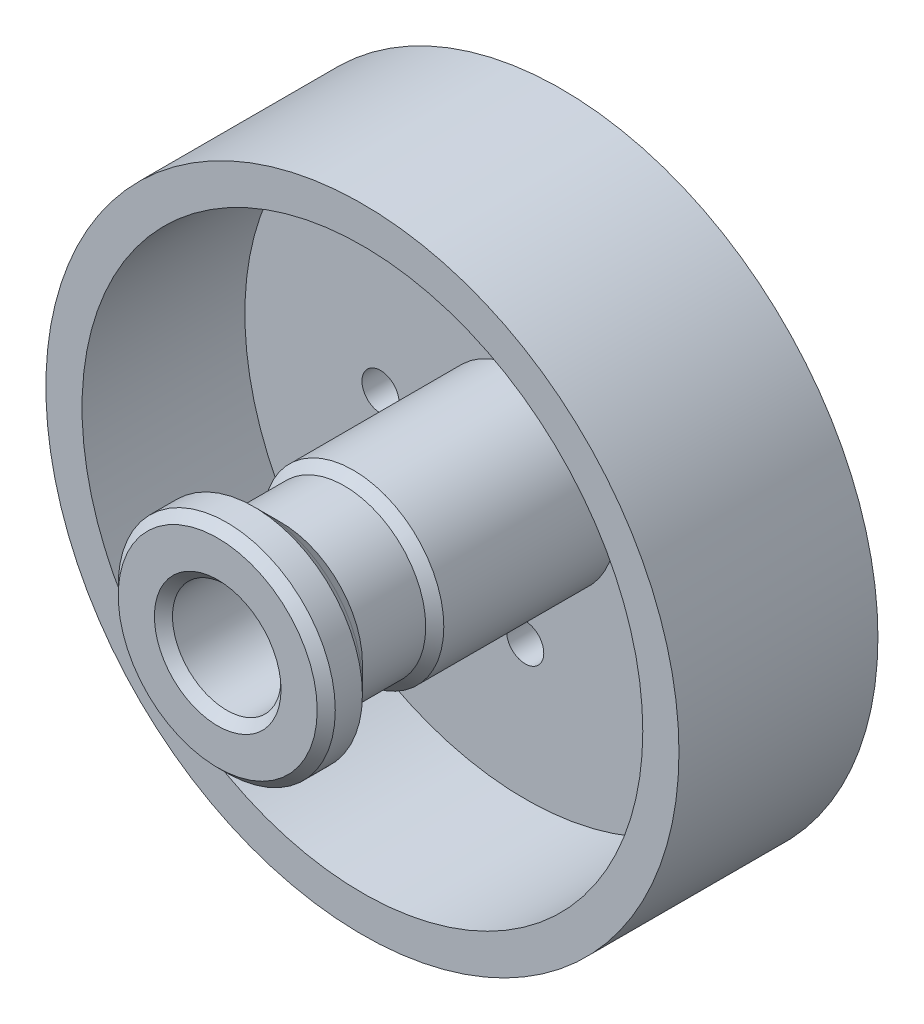
ISO-10303-21;
HEADER;
FILE_DESCRIPTION(('STEP AP214'),'2;1');
FILE_NAME('part.step','',(''),(''),'','','');
FILE_SCHEMA(('AUTOMOTIVE_DESIGN { 1 0 10303 214 1 1 1 1 }'));
ENDSEC;
DATA;
#1=APPLICATION_CONTEXT('core data for automotive mechanical design processes');
#2=APPLICATION_PROTOCOL_DEFINITION('international standard','automotive_design',2000,#1);
#3=PRODUCT_CONTEXT('',#1,'mechanical');
#4=PRODUCT('Part','Part','',(#3));
#5=PRODUCT_RELATED_PRODUCT_CATEGORY('part','',(#4));
#6=PRODUCT_DEFINITION_FORMATION('','',#4);
#7=PRODUCT_DEFINITION_CONTEXT('part definition',#1,'design');
#8=PRODUCT_DEFINITION('design','',#6,#7);
#9=PRODUCT_DEFINITION_SHAPE('','',#8);
#10=(LENGTH_UNIT() NAMED_UNIT(*) SI_UNIT(.MILLI.,.METRE.));
#11=(NAMED_UNIT(*) PLANE_ANGLE_UNIT() SI_UNIT($,.RADIAN.));
#12=(NAMED_UNIT(*) SI_UNIT($,.STERADIAN.) SOLID_ANGLE_UNIT());
#13=UNCERTAINTY_MEASURE_WITH_UNIT(LENGTH_MEASURE(1.E-05),#10,'distance_accuracy_value','');
#14=(GEOMETRIC_REPRESENTATION_CONTEXT(3) GLOBAL_UNCERTAINTY_ASSIGNED_CONTEXT((#13)) GLOBAL_UNIT_ASSIGNED_CONTEXT((#10,
#11,#12)) REPRESENTATION_CONTEXT('',''));
#15=CARTESIAN_POINT('',(0.,0.,0.));
#16=DIRECTION('',(0.,0.,1.));
#17=DIRECTION('',(1.,0.,0.));
#18=AXIS2_PLACEMENT_3D('',#15,#16,#17);
#19=CARTESIAN_POINT('',(0.,0.,8.));
#20=DIRECTION('',(0.,0.,-1.));
#21=DIRECTION('',(-1.,0.,0.));
#22=AXIS2_PLACEMENT_3D('',#19,#20,#21);
#23=CYLINDRICAL_SURFACE('',#22,4.5);
#24=CARTESIAN_POINT('',(0.,0.,4.50000000000001));
#25=DIRECTION('',(0.,0.,1.));
#26=DIRECTION('',(1.,0.,0.));
#27=AXIS2_PLACEMENT_3D('',#24,#25,#26);
#28=CIRCLE('',#27,4.5);
#29=CARTESIAN_POINT('',(4.5,0.,4.50000000000001));
#30=VERTEX_POINT('',#29);
#31=EDGE_CURVE('E50',#30,#30,#28,.F.);
#32=ORIENTED_EDGE('',*,*,#31,.T.);
#33=EDGE_LOOP('',(#32));
#34=FACE_BOUND('',#33,.T.);
#35=CARTESIAN_POINT('',(0.,0.,1.00000000000002));
#36=DIRECTION('',(0.,0.,1.));
#37=DIRECTION('',(1.,0.,0.));
#38=AXIS2_PLACEMENT_3D('',#35,#36,#37);
#39=CIRCLE('',#38,4.5);
#40=CARTESIAN_POINT('',(4.5,0.,1.00000000000002));
#41=VERTEX_POINT('',#40);
#42=EDGE_CURVE('E54',#41,#41,#39,.T.);
#43=ORIENTED_EDGE('',*,*,#42,.T.);
#44=EDGE_LOOP('',(#43));
#45=FACE_BOUND('',#44,.T.);
#46=ADVANCED_FACE('F42',(#34,#45),#23,.T.);
#47=CARTESIAN_POINT('',(0.,0.,-11.));
#48=DIRECTION('',(0.,0.,1.));
#49=DIRECTION('',(1.,0.,0.));
#50=AXIS2_PLACEMENT_3D('',#47,#48,#49);
#51=CYLINDRICAL_SURFACE('',#50,17.5);
#52=CARTESIAN_POINT('',(0.,0.,-11.));
#53=DIRECTION('',(0.,0.,1.));
#54=DIRECTION('',(1.,0.,0.));
#55=AXIS2_PLACEMENT_3D('',#52,#53,#54);
#56=CIRCLE('',#55,17.5);
#57=CARTESIAN_POINT('',(17.5,0.,-11.));
#58=VERTEX_POINT('',#57);
#59=EDGE_CURVE('E78',#58,#58,#56,.T.);
#60=ORIENTED_EDGE('',*,*,#59,.T.);
#61=EDGE_LOOP('',(#60));
#62=FACE_BOUND('',#61,.T.);
#63=CARTESIAN_POINT('',(0.,0.,0.));
#64=DIRECTION('',(0.,0.,1.));
#65=DIRECTION('',(1.,0.,0.));
#66=AXIS2_PLACEMENT_3D('',#63,#64,#65);
#67=CIRCLE('',#66,17.5);
#68=CARTESIAN_POINT('',(17.5,0.,0.));
#69=VERTEX_POINT('',#68);
#70=EDGE_CURVE('E92',#69,#69,#67,.T.);
#71=ORIENTED_EDGE('',*,*,#70,.F.);
#72=EDGE_LOOP('',(#71));
#73=FACE_BOUND('',#72,.T.);
#74=ADVANCED_FACE('F127',(#62,#73),#51,.T.);
#75=CARTESIAN_POINT('',(0.,0.,-11.));
#76=DIRECTION('',(0.,0.,1.));
#77=DIRECTION('',(1.,0.,0.));
#78=AXIS2_PLACEMENT_3D('',#75,#76,#77);
#79=PLANE('',#78);
#80=CARTESIAN_POINT('',(0.,7.99999999999999,-11.));
#81=DIRECTION('',(0.,0.,-1.));
#82=DIRECTION('',(-1.,0.,0.));
#83=AXIS2_PLACEMENT_3D('',#80,#81,#82);
#84=CIRCLE('',#83,1.02499999999999);
#85=CARTESIAN_POINT('',(-1.02499999999999,7.99999999999999,-11.));
#86=VERTEX_POINT('',#85);
#87=EDGE_CURVE('E83',#86,#86,#84,.T.);
#88=ORIENTED_EDGE('',*,*,#87,.F.);
#89=EDGE_LOOP('',(#88));
#90=FACE_BOUND('',#89,.T.);
#91=CARTESIAN_POINT('',(-7.99999999999999,0.,-11.));
#92=DIRECTION('',(0.,0.,-1.));
#93=DIRECTION('',(-1.,0.,0.));
#94=AXIS2_PLACEMENT_3D('',#91,#92,#93);
#95=CIRCLE('',#94,1.02499999999999);
#96=CARTESIAN_POINT('',(-9.02499999999998,0.,-11.));
#97=VERTEX_POINT('',#96);
#98=EDGE_CURVE('E82',#97,#97,#95,.T.);
#99=ORIENTED_EDGE('',*,*,#98,.F.);
#100=EDGE_LOOP('',(#99));
#101=FACE_BOUND('',#100,.T.);
#102=CARTESIAN_POINT('',(0.,-7.99999999999999,-11.));
#103=DIRECTION('',(0.,0.,-1.));
#104=DIRECTION('',(-1.,0.,0.));
#105=AXIS2_PLACEMENT_3D('',#102,#103,#104);
#106=CIRCLE('',#105,1.02499999999999);
#107=CARTESIAN_POINT('',(-1.02499999999999,-7.99999999999999,-11.));
#108=VERTEX_POINT('',#107);
#109=EDGE_CURVE('E87',#108,#108,#106,.T.);
#110=ORIENTED_EDGE('',*,*,#109,.F.);
#111=EDGE_LOOP('',(#110));
#112=FACE_BOUND('',#111,.T.);
#113=CARTESIAN_POINT('',(7.99999999999999,0.,-11.));
#114=DIRECTION('',(0.,0.,-1.));
#115=DIRECTION('',(-1.,0.,0.));
#116=AXIS2_PLACEMENT_3D('',#113,#114,#115);
#117=CIRCLE('',#116,1.02499999999999);
#118=CARTESIAN_POINT('',(6.975,0.,-11.));
#119=VERTEX_POINT('',#118);
#120=EDGE_CURVE('E91',#119,#119,#117,.T.);
#121=ORIENTED_EDGE('',*,*,#120,.F.);
#122=EDGE_LOOP('',(#121));
#123=FACE_BOUND('',#122,.T.);
#124=CARTESIAN_POINT('',(0.,0.,-11.));
#125=DIRECTION('',(0.,0.,1.));
#126=DIRECTION('',(1.,0.,0.));
#127=AXIS2_PLACEMENT_3D('',#124,#125,#126);
#128=CIRCLE('',#127,3.);
#129=CARTESIAN_POINT('',(3.,0.,-11.));
#130=VERTEX_POINT('',#129);
#131=EDGE_CURVE('E95',#130,#130,#128,.T.);
#132=ORIENTED_EDGE('',*,*,#131,.T.);
#133=EDGE_LOOP('',(#132));
#134=FACE_BOUND('',#133,.T.);
#135=ORIENTED_EDGE('',*,*,#59,.F.);
#136=EDGE_LOOP('',(#135));
#137=FACE_BOUND('',#136,.T.);
#138=ADVANCED_FACE('F123',(#90,#101,#112,#123,#134,#137),#79,.F.);
#139=CARTESIAN_POINT('',(0.,0.,0.));
#140=DIRECTION('',(0.,0.,1.));
#141=DIRECTION('',(1.,0.,0.));
#142=AXIS2_PLACEMENT_3D('',#139,#140,#141);
#143=PLANE('',#142);
#144=CARTESIAN_POINT('',(0.,0.,0.));
#145=DIRECTION('',(0.,0.,1.));
#146=DIRECTION('',(1.,0.,0.));
#147=AXIS2_PLACEMENT_3D('',#144,#145,#146);
#148=CIRCLE('',#147,15.5);
#149=CARTESIAN_POINT('',(15.5,0.,0.));
#150=VERTEX_POINT('',#149);
#151=EDGE_CURVE('E101',#150,#150,#148,.T.);
#152=ORIENTED_EDGE('',*,*,#151,.F.);
#153=EDGE_LOOP('',(#152));
#154=FACE_BOUND('',#153,.T.);
#155=ORIENTED_EDGE('',*,*,#70,.T.);
#156=EDGE_LOOP('',(#155));
#157=FACE_BOUND('',#156,.T.);
#158=ADVANCED_FACE('F126',(#154,#157),#143,.T.);
#159=CARTESIAN_POINT('',(0.,0.,-11.));
#160=DIRECTION('',(0.,0.,1.));
#161=DIRECTION('',(1.,0.,0.));
#162=AXIS2_PLACEMENT_3D('',#159,#160,#161);
#163=CYLINDRICAL_SURFACE('',#162,3.);
#164=CARTESIAN_POINT('',(0.,0.,7.5));
#165=DIRECTION('',(0.,0.,1.));
#166=DIRECTION('',(1.,0.,0.));
#167=AXIS2_PLACEMENT_3D('',#164,#165,#166);
#168=CIRCLE('',#167,3.);
#169=CARTESIAN_POINT('',(3.,0.,7.5));
#170=VERTEX_POINT('',#169);
#171=EDGE_CURVE('E63',#170,#170,#168,.T.);
#172=ORIENTED_EDGE('',*,*,#171,.T.);
#173=EDGE_LOOP('',(#172));
#174=FACE_BOUND('',#173,.T.);
#175=ORIENTED_EDGE('',*,*,#131,.F.);
#176=EDGE_LOOP('',(#175));
#177=FACE_BOUND('',#176,.T.);
#178=ADVANCED_FACE('F145',(#174,#177),#163,.F.);
#179=CARTESIAN_POINT('',(0.,0.,-11.));
#180=DIRECTION('',(0.,0.,1.));
#181=DIRECTION('',(1.,0.,0.));
#182=AXIS2_PLACEMENT_3D('',#179,#180,#181);
#183=CYLINDRICAL_SURFACE('',#182,15.5);
#184=CARTESIAN_POINT('',(0.,0.,-9.));
#185=DIRECTION('',(0.,0.,1.));
#186=DIRECTION('',(1.,0.,0.));
#187=AXIS2_PLACEMENT_3D('',#184,#185,#186);
#188=CIRCLE('',#187,15.5);
#189=CARTESIAN_POINT('',(15.5,0.,-9.));
#190=VERTEX_POINT('',#189);
#191=EDGE_CURVE('E100',#190,#190,#188,.T.);
#192=ORIENTED_EDGE('',*,*,#191,.F.);
#193=EDGE_LOOP('',(#192));
#194=FACE_BOUND('',#193,.T.);
#195=ORIENTED_EDGE('',*,*,#151,.T.);
#196=EDGE_LOOP('',(#195));
#197=FACE_BOUND('',#196,.T.);
#198=ADVANCED_FACE('F151',(#194,#197),#183,.F.);
#199=CARTESIAN_POINT('',(0.,0.,-9.));
#200=DIRECTION('',(0.,0.,1.));
#201=DIRECTION('',(1.,0.,0.));
#202=AXIS2_PLACEMENT_3D('',#199,#200,#201);
#203=PLANE('',#202);
#204=CARTESIAN_POINT('',(0.,7.99999999999999,-9.));
#205=DIRECTION('',(0.,0.,1.));
#206=DIRECTION('',(1.,0.,0.));
#207=AXIS2_PLACEMENT_3D('',#204,#205,#206);
#208=CIRCLE('',#207,1.02499999999999);
#209=CARTESIAN_POINT('',(1.02499999999999,7.99999999999999,-9.));
#210=VERTEX_POINT('',#209);
#211=EDGE_CURVE('E79',#210,#210,#208,.T.);
#212=ORIENTED_EDGE('',*,*,#211,.F.);
#213=EDGE_LOOP('',(#212));
#214=FACE_BOUND('',#213,.T.);
#215=CARTESIAN_POINT('',(-7.99999999999999,0.,-9.));
#216=DIRECTION('',(0.,0.,1.));
#217=DIRECTION('',(1.,0.,0.));
#218=AXIS2_PLACEMENT_3D('',#215,#216,#217);
#219=CIRCLE('',#218,1.02499999999999);
#220=CARTESIAN_POINT('',(-6.975,0.,-9.));
#221=VERTEX_POINT('',#220);
#222=EDGE_CURVE('E84',#221,#221,#219,.T.);
#223=ORIENTED_EDGE('',*,*,#222,.F.);
#224=EDGE_LOOP('',(#223));
#225=FACE_BOUND('',#224,.T.);
#226=CARTESIAN_POINT('',(0.,-7.99999999999999,-9.));
#227=DIRECTION('',(0.,0.,1.));
#228=DIRECTION('',(1.,0.,0.));
#229=AXIS2_PLACEMENT_3D('',#226,#227,#228);
#230=CIRCLE('',#229,1.02499999999999);
#231=CARTESIAN_POINT('',(1.02499999999999,-7.99999999999999,-9.));
#232=VERTEX_POINT('',#231);
#233=EDGE_CURVE('E88',#232,#232,#230,.T.);
#234=ORIENTED_EDGE('',*,*,#233,.F.);
#235=EDGE_LOOP('',(#234));
#236=FACE_BOUND('',#235,.T.);
#237=CARTESIAN_POINT('',(7.99999999999999,0.,-9.));
#238=DIRECTION('',(0.,0.,1.));
#239=DIRECTION('',(1.,0.,0.));
#240=AXIS2_PLACEMENT_3D('',#237,#238,#239);
#241=CIRCLE('',#240,1.02499999999999);
#242=CARTESIAN_POINT('',(9.02499999999999,0.,-9.));
#243=VERTEX_POINT('',#242);
#244=EDGE_CURVE('E107',#243,#243,#241,.T.);
#245=ORIENTED_EDGE('',*,*,#244,.F.);
#246=EDGE_LOOP('',(#245));
#247=FACE_BOUND('',#246,.T.);
#248=CARTESIAN_POINT('',(0.,0.,-9.));
#249=DIRECTION('',(0.,0.,1.));
#250=DIRECTION('',(1.,0.,0.));
#251=AXIS2_PLACEMENT_3D('',#248,#249,#250);
#252=CIRCLE('',#251,5.);
#253=CARTESIAN_POINT('',(5.,0.,-9.));
#254=VERTEX_POINT('',#253);
#255=EDGE_CURVE('E104',#254,#254,#252,.T.);
#256=ORIENTED_EDGE('',*,*,#255,.F.);
#257=EDGE_LOOP('',(#256));
#258=FACE_BOUND('',#257,.T.);
#259=ORIENTED_EDGE('',*,*,#191,.T.);
#260=EDGE_LOOP('',(#259));
#261=FACE_BOUND('',#260,.T.);
#262=ADVANCED_FACE('F182',(#214,#225,#236,#247,#258,#261),#203,.T.);
#263=CARTESIAN_POINT('',(0.,0.,-11.));
#264=DIRECTION('',(0.,0.,1.));
#265=DIRECTION('',(1.,0.,0.));
#266=AXIS2_PLACEMENT_3D('',#263,#264,#265);
#267=CYLINDRICAL_SURFACE('',#266,5.);
#268=CARTESIAN_POINT('',(0.,0.,0.500000000000013));
#269=DIRECTION('',(0.,0.,-1.));
#270=DIRECTION('',(-1.,0.,0.));
#271=AXIS2_PLACEMENT_3D('',#268,#269,#270);
#272=CIRCLE('',#271,5.);
#273=CARTESIAN_POINT('',(-5.,0.,0.500000000000013));
#274=VERTEX_POINT('',#273);
#275=EDGE_CURVE('E10',#274,#274,#272,.T.);
#276=ORIENTED_EDGE('',*,*,#275,.T.);
#277=EDGE_LOOP('',(#276));
#278=FACE_BOUND('',#277,.T.);
#279=ORIENTED_EDGE('',*,*,#255,.T.);
#280=EDGE_LOOP('',(#279));
#281=FACE_BOUND('',#280,.T.);
#282=ADVANCED_FACE('F178',(#278,#281),#267,.T.);
#283=CARTESIAN_POINT('',(7.99999999999999,0.,-11.));
#284=DIRECTION('',(0.,0.,-1.));
#285=DIRECTION('',(-1.,0.,0.));
#286=AXIS2_PLACEMENT_3D('',#283,#284,#285);
#287=CYLINDRICAL_SURFACE('',#286,1.02499999999999);
#288=ORIENTED_EDGE('',*,*,#244,.T.);
#289=EDGE_LOOP('',(#288));
#290=FACE_BOUND('',#289,.T.);
#291=ORIENTED_EDGE('',*,*,#120,.T.);
#292=EDGE_LOOP('',(#291));
#293=FACE_BOUND('',#292,.T.);
#294=ADVANCED_FACE('F174',(#290,#293),#287,.F.);
#295=CARTESIAN_POINT('',(0.,-7.99999999999999,-11.));
#296=DIRECTION('',(0.,0.,-1.));
#297=DIRECTION('',(-1.,0.,0.));
#298=AXIS2_PLACEMENT_3D('',#295,#296,#297);
#299=CYLINDRICAL_SURFACE('',#298,1.02499999999999);
#300=ORIENTED_EDGE('',*,*,#233,.T.);
#301=EDGE_LOOP('',(#300));
#302=FACE_BOUND('',#301,.T.);
#303=ORIENTED_EDGE('',*,*,#109,.T.);
#304=EDGE_LOOP('',(#303));
#305=FACE_BOUND('',#304,.T.);
#306=ADVANCED_FACE('F170',(#302,#305),#299,.F.);
#307=CARTESIAN_POINT('',(-7.99999999999999,0.,-11.));
#308=DIRECTION('',(0.,0.,-1.));
#309=DIRECTION('',(-1.,0.,0.));
#310=AXIS2_PLACEMENT_3D('',#307,#308,#309);
#311=CYLINDRICAL_SURFACE('',#310,1.02499999999999);
#312=ORIENTED_EDGE('',*,*,#222,.T.);
#313=EDGE_LOOP('',(#312));
#314=FACE_BOUND('',#313,.T.);
#315=ORIENTED_EDGE('',*,*,#98,.T.);
#316=EDGE_LOOP('',(#315));
#317=FACE_BOUND('',#316,.T.);
#318=ADVANCED_FACE('F166',(#314,#317),#311,.F.);
#319=CARTESIAN_POINT('',(0.,7.99999999999999,-11.));
#320=DIRECTION('',(0.,0.,-1.));
#321=DIRECTION('',(-1.,0.,0.));
#322=AXIS2_PLACEMENT_3D('',#319,#320,#321);
#323=CYLINDRICAL_SURFACE('',#322,1.02499999999999);
#324=ORIENTED_EDGE('',*,*,#211,.T.);
#325=EDGE_LOOP('',(#324));
#326=FACE_BOUND('',#325,.T.);
#327=ORIENTED_EDGE('',*,*,#87,.T.);
#328=EDGE_LOOP('',(#327));
#329=FACE_BOUND('',#328,.T.);
#330=ADVANCED_FACE('F121',(#326,#329),#323,.F.);
#331=CARTESIAN_POINT('',(0.,0.,8.));
#332=DIRECTION('',(0.,0.,1.));
#333=DIRECTION('',(1.,0.,0.));
#334=AXIS2_PLACEMENT_3D('',#331,#332,#333);
#335=PLANE('',#334);
#336=CARTESIAN_POINT('',(0.,0.,8.));
#337=DIRECTION('',(0.,0.,1.));
#338=DIRECTION('',(1.,0.,0.));
#339=AXIS2_PLACEMENT_3D('',#336,#337,#338);
#340=CIRCLE('',#339,5.50000000000001);
#341=CARTESIAN_POINT('',(5.50000000000001,0.,8.));
#342=VERTEX_POINT('',#341);
#343=EDGE_CURVE('E72',#342,#342,#340,.T.);
#344=ORIENTED_EDGE('',*,*,#343,.T.);
#345=EDGE_LOOP('',(#344));
#346=FACE_BOUND('',#345,.T.);
#347=CARTESIAN_POINT('',(0.,0.,8.));
#348=DIRECTION('',(0.,0.,1.));
#349=DIRECTION('',(1.,0.,0.));
#350=AXIS2_PLACEMENT_3D('',#347,#348,#349);
#351=CIRCLE('',#350,3.5);
#352=CARTESIAN_POINT('',(3.5,0.,8.));
#353=VERTEX_POINT('',#352);
#354=EDGE_CURVE('E75',#353,#353,#351,.F.);
#355=ORIENTED_EDGE('',*,*,#354,.T.);
#356=EDGE_LOOP('',(#355));
#357=FACE_BOUND('',#356,.T.);
#358=ADVANCED_FACE('F162',(#346,#357),#335,.T.);
#359=CARTESIAN_POINT('',(0.,0.,5.5));
#360=DIRECTION('',(0.,0.,1.));
#361=DIRECTION('',(1.,0.,0.));
#362=AXIS2_PLACEMENT_3D('',#359,#360,#361);
#363=CYLINDRICAL_SURFACE('',#362,6.);
#364=CARTESIAN_POINT('',(0.,0.,7.5));
#365=DIRECTION('',(0.,0.,1.));
#366=DIRECTION('',(1.,0.,0.));
#367=AXIS2_PLACEMENT_3D('',#364,#365,#366);
#368=CIRCLE('',#367,6.);
#369=CARTESIAN_POINT('',(6.,0.,7.5));
#370=VERTEX_POINT('',#369);
#371=EDGE_CURVE('E66',#370,#370,#368,.F.);
#372=ORIENTED_EDGE('',*,*,#371,.T.);
#373=EDGE_LOOP('',(#372));
#374=FACE_BOUND('',#373,.T.);
#375=CARTESIAN_POINT('',(0.,0.,5.99999999999999));
#376=DIRECTION('',(0.,0.,1.));
#377=DIRECTION('',(1.,0.,0.));
#378=AXIS2_PLACEMENT_3D('',#375,#376,#377);
#379=CIRCLE('',#378,6.);
#380=CARTESIAN_POINT('',(6.,0.,5.99999999999999));
#381=VERTEX_POINT('',#380);
#382=EDGE_CURVE('E69',#381,#381,#379,.T.);
#383=ORIENTED_EDGE('',*,*,#382,.T.);
#384=EDGE_LOOP('',(#383));
#385=FACE_BOUND('',#384,.T.);
#386=ADVANCED_FACE('F222',(#374,#385),#363,.T.);
#387=CARTESIAN_POINT('',(0.,0.,8.));
#388=DIRECTION('',(0.,0.,-1.));
#389=DIRECTION('',(-1.,0.,0.));
#390=AXIS2_PLACEMENT_3D('',#387,#388,#389);
#391=CONICAL_SURFACE('',#390,5.50000000000001,0.785398163397447);
#392=ORIENTED_EDGE('',*,*,#371,.F.);
#393=EDGE_LOOP('',(#392));
#394=FACE_BOUND('',#393,.T.);
#395=ORIENTED_EDGE('',*,*,#343,.F.);
#396=EDGE_LOOP('',(#395));
#397=FACE_BOUND('',#396,.T.);
#398=ADVANCED_FACE('F230',(#394,#397),#391,.T.);
#399=CARTESIAN_POINT('',(0.,0.,7.5));
#400=DIRECTION('',(0.,0.,1.));
#401=DIRECTION('',(1.,0.,0.));
#402=AXIS2_PLACEMENT_3D('',#399,#400,#401);
#403=CONICAL_SURFACE('',#402,3.,0.785398163397445);
#404=ORIENTED_EDGE('',*,*,#354,.F.);
#405=EDGE_LOOP('',(#404));
#406=FACE_BOUND('',#405,.T.);
#407=ORIENTED_EDGE('',*,*,#171,.F.);
#408=EDGE_LOOP('',(#407));
#409=FACE_BOUND('',#408,.T.);
#410=ADVANCED_FACE('F237',(#406,#409),#403,.F.);
#411=CARTESIAN_POINT('',(0.,0.,5.99999999999999));
#412=DIRECTION('',(0.,0.,1.));
#413=DIRECTION('',(1.,0.,0.));
#414=AXIS2_PLACEMENT_3D('',#411,#412,#413);
#415=CONICAL_SURFACE('',#414,6.,0.785398163397448);
#416=CARTESIAN_POINT('',(0.,0.,5.5));
#417=DIRECTION('',(0.,0.,1.));
#418=DIRECTION('',(1.,0.,0.));
#419=AXIS2_PLACEMENT_3D('',#416,#417,#418);
#420=CIRCLE('',#419,5.50000000000001);
#421=CARTESIAN_POINT('',(5.50000000000001,0.,5.5));
#422=VERTEX_POINT('',#421);
#423=EDGE_CURVE('E58',#422,#422,#420,.F.);
#424=ORIENTED_EDGE('',*,*,#423,.F.);
#425=EDGE_LOOP('',(#424));
#426=FACE_BOUND('',#425,.T.);
#427=ORIENTED_EDGE('',*,*,#382,.F.);
#428=EDGE_LOOP('',(#427));
#429=FACE_BOUND('',#428,.T.);
#430=ADVANCED_FACE('F245',(#426,#429),#415,.T.);
#431=CARTESIAN_POINT('',(0.,0.,5.5));
#432=DIRECTION('',(0.,0.,1.));
#433=DIRECTION('',(1.,0.,0.));
#434=AXIS2_PLACEMENT_3D('',#431,#432,#433);
#435=CONICAL_SURFACE('',#434,5.5,0.785398163397453);
#436=ORIENTED_EDGE('',*,*,#31,.F.);
#437=EDGE_LOOP('',(#436));
#438=FACE_BOUND('',#437,.T.);
#439=ORIENTED_EDGE('',*,*,#423,.T.);
#440=EDGE_LOOP('',(#439));
#441=FACE_BOUND('',#440,.T.);
#442=ADVANCED_FACE('F253',(#438,#441),#435,.T.);
#443=CARTESIAN_POINT('',(0.,0.,1.00000000000002));
#444=DIRECTION('',(0.,0.,-1.));
#445=DIRECTION('',(-1.,0.,0.));
#446=AXIS2_PLACEMENT_3D('',#443,#444,#445);
#447=CONICAL_SURFACE('',#446,4.5,0.785398163397443);
#448=ORIENTED_EDGE('',*,*,#275,.F.);
#449=EDGE_LOOP('',(#448));
#450=FACE_BOUND('',#449,.T.);
#451=ORIENTED_EDGE('',*,*,#42,.F.);
#452=EDGE_LOOP('',(#451));
#453=FACE_BOUND('',#452,.T.);
#454=ADVANCED_FACE('F45',(#450,#453),#447,.T.);
#455=CLOSED_SHELL('',(#46,#74,#138,#158,#178,#198,#262,#282,#294,#306,#318,#330,#358,#386,#398,
#410,#430,#442,#454));
#456=MANIFOLD_SOLID_BREP('B2',#455);
#457=ADVANCED_BREP_SHAPE_REPRESENTATION('',(#18,#456),#14);
#458=SHAPE_DEFINITION_REPRESENTATION(#9,#457);
ENDSEC;
END-ISO-10303-21;
